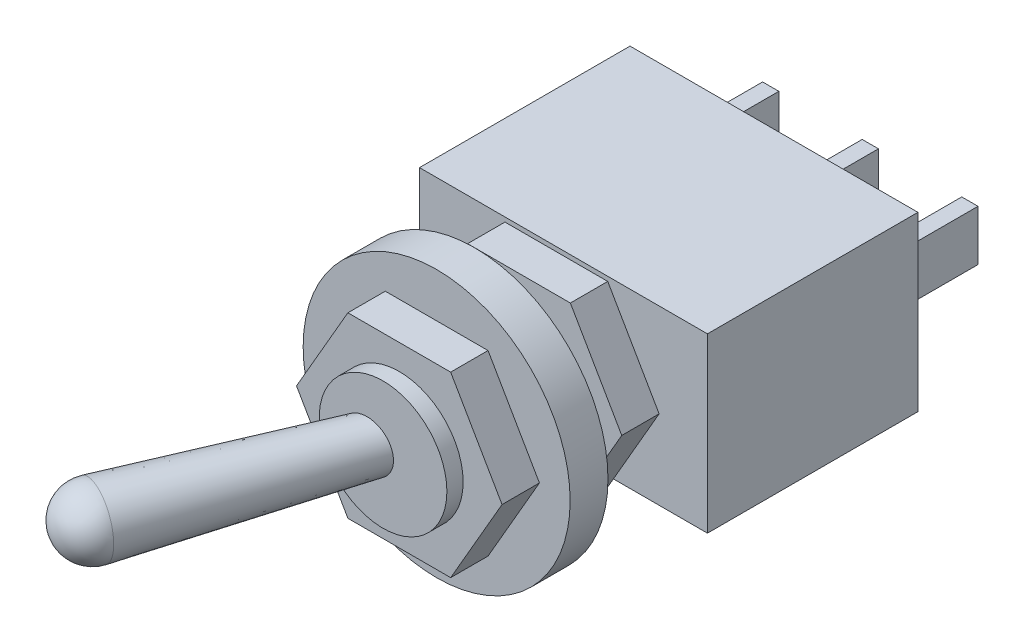
ISO-10303-21;
HEADER;
FILE_DESCRIPTION(('STEP AP214'),'2;1');
FILE_NAME('part.step','',(''),(''),'','','');
FILE_SCHEMA(('AUTOMOTIVE_DESIGN { 1 0 10303 214 1 1 1 1 }'));
ENDSEC;
DATA;
#1=APPLICATION_CONTEXT('core data for automotive mechanical design processes');
#2=APPLICATION_PROTOCOL_DEFINITION('international standard','automotive_design',2000,#1);
#3=PRODUCT_CONTEXT('',#1,'mechanical');
#4=PRODUCT('Part','Part','',(#3));
#5=PRODUCT_RELATED_PRODUCT_CATEGORY('part','',(#4));
#6=PRODUCT_DEFINITION_FORMATION('','',#4);
#7=PRODUCT_DEFINITION_CONTEXT('part definition',#1,'design');
#8=PRODUCT_DEFINITION('design','',#6,#7);
#9=PRODUCT_DEFINITION_SHAPE('','',#8);
#10=(LENGTH_UNIT() NAMED_UNIT(*) SI_UNIT(.MILLI.,.METRE.));
#11=(NAMED_UNIT(*) PLANE_ANGLE_UNIT() SI_UNIT($,.RADIAN.));
#12=(NAMED_UNIT(*) SI_UNIT($,.STERADIAN.) SOLID_ANGLE_UNIT());
#13=UNCERTAINTY_MEASURE_WITH_UNIT(LENGTH_MEASURE(1.E-05),#10,'distance_accuracy_value','');
#14=(GEOMETRIC_REPRESENTATION_CONTEXT(3) GLOBAL_UNCERTAINTY_ASSIGNED_CONTEXT((#13)) GLOBAL_UNIT_ASSIGNED_CONTEXT((#10,
#11,#12)) REPRESENTATION_CONTEXT('',''));
#15=CARTESIAN_POINT('',(0.,0.,0.));
#16=DIRECTION('',(0.,0.,1.));
#17=DIRECTION('',(1.,0.,0.));
#18=AXIS2_PLACEMENT_3D('',#15,#16,#17);
#19=CARTESIAN_POINT('',(0.,0.,15.16));
#20=DIRECTION('',(0.,0.,1.));
#21=DIRECTION('',(1.,0.,0.));
#22=AXIS2_PLACEMENT_3D('',#19,#20,#21);
#23=PLANE('',#22);
#24=CARTESIAN_POINT('',(0.,0.,15.16));
#25=DIRECTION('',(0.,0.,1.));
#26=DIRECTION('',(1.,0.,0.));
#27=AXIS2_PLACEMENT_3D('',#24,#25,#26);
#28=CIRCLE('',#27,6.);
#29=CARTESIAN_POINT('',(6.,0.,15.16));
#30=VERTEX_POINT('',#29);
#31=EDGE_CURVE('E266',#30,#30,#28,.T.);
#32=ORIENTED_EDGE('',*,*,#31,.T.);
#33=EDGE_LOOP('',(#32));
#34=FACE_BOUND('',#33,.T.);
#35=DIRECTION('',(1.,0.,0.));
#36=VECTOR('',#35,1.);
#37=CARTESIAN_POINT('',(-2.30940107675851,-4.,15.16));
#38=LINE('',#37,#36);
#39=CARTESIAN_POINT('',(-2.30940107675851,-4.,15.16));
#40=VERTEX_POINT('',#39);
#41=CARTESIAN_POINT('',(2.3094010767585,-4.,15.16));
#42=VERTEX_POINT('',#41);
#43=EDGE_CURVE('E950',#40,#42,#38,.T.);
#44=ORIENTED_EDGE('',*,*,#43,.F.);
#45=DIRECTION('',(0.5,-0.866025403784439,0.));
#46=VECTOR('',#45,1.);
#47=CARTESIAN_POINT('',(-4.61880215351701,0.,15.16));
#48=LINE('',#47,#46);
#49=CARTESIAN_POINT('',(-4.61880215351701,0.,15.16));
#50=VERTEX_POINT('',#49);
#51=EDGE_CURVE('E257',#50,#40,#48,.T.);
#52=ORIENTED_EDGE('',*,*,#51,.F.);
#53=DIRECTION('',(-0.5,-0.866025403784439,0.));
#54=VECTOR('',#53,1.);
#55=CARTESIAN_POINT('',(-2.3094010767585,4.,15.16));
#56=LINE('',#55,#54);
#57=CARTESIAN_POINT('',(-2.3094010767585,4.,15.16));
#58=VERTEX_POINT('',#57);
#59=EDGE_CURVE('E253',#58,#50,#56,.T.);
#60=ORIENTED_EDGE('',*,*,#59,.F.);
#61=DIRECTION('',(-1.,0.,0.));
#62=VECTOR('',#61,1.);
#63=CARTESIAN_POINT('',(2.3094010767585,4.,15.16));
#64=LINE('',#63,#62);
#65=CARTESIAN_POINT('',(2.3094010767585,4.,15.16));
#66=VERTEX_POINT('',#65);
#67=EDGE_CURVE('E958',#66,#58,#64,.T.);
#68=ORIENTED_EDGE('',*,*,#67,.F.);
#69=DIRECTION('',(-0.499999999999999,0.866025403784439,0.));
#70=VECTOR('',#69,1.);
#71=CARTESIAN_POINT('',(4.618802153517,0.,15.16));
#72=LINE('',#71,#70);
#73=CARTESIAN_POINT('',(4.618802153517,0.,15.16));
#74=VERTEX_POINT('',#73);
#75=EDGE_CURVE('E949',#74,#66,#72,.T.);
#76=ORIENTED_EDGE('',*,*,#75,.F.);
#77=DIRECTION('',(0.5,0.866025403784439,0.));
#78=VECTOR('',#77,1.);
#79=CARTESIAN_POINT('',(2.3094010767585,-4.,15.16));
#80=LINE('',#79,#78);
#81=EDGE_CURVE('E945',#42,#74,#80,.T.);
#82=ORIENTED_EDGE('',*,*,#81,.F.);
#83=EDGE_LOOP('',(#44,#52,#60,#68,#76,#82));
#84=FACE_BOUND('',#83,.T.);
#85=ADVANCED_FACE('F47',(#34,#84),#23,.T.);
#86=CARTESIAN_POINT('',(0.,0.,17.57));
#87=DIRECTION('',(0.,0.,-1.));
#88=DIRECTION('',(-1.,0.,0.));
#89=AXIS2_PLACEMENT_3D('',#86,#87,#88);
#90=CYLINDRICAL_SURFACE('',#89,2.87);
#91=CARTESIAN_POINT('',(0.,0.,11.46));
#92=DIRECTION('',(0.,0.,1.));
#93=DIRECTION('',(1.,0.,0.));
#94=AXIS2_PLACEMENT_3D('',#91,#92,#93);
#95=CIRCLE('',#94,2.87);
#96=CARTESIAN_POINT('',(2.87,0.,11.46));
#97=VERTEX_POINT('',#96);
#98=EDGE_CURVE('E310',#97,#97,#95,.T.);
#99=ORIENTED_EDGE('',*,*,#98,.T.);
#100=EDGE_LOOP('',(#99));
#101=FACE_BOUND('',#100,.T.);
#102=CARTESIAN_POINT('',(0.,0.,13.46));
#103=DIRECTION('',(0.,0.,1.));
#104=DIRECTION('',(1.,0.,0.));
#105=AXIS2_PLACEMENT_3D('',#102,#103,#104);
#106=CIRCLE('',#105,2.87);
#107=CARTESIAN_POINT('',(2.87,0.,13.46));
#108=VERTEX_POINT('',#107);
#109=EDGE_CURVE('E13',#108,#108,#106,.T.);
#110=ORIENTED_EDGE('',*,*,#109,.F.);
#111=EDGE_LOOP('',(#110));
#112=FACE_BOUND('',#111,.T.);
#113=ADVANCED_FACE('F458',(#101,#112),#90,.T.);
#114=CARTESIAN_POINT('',(0.,0.,9.46));
#115=DIRECTION('',(0.,0.,1.));
#116=DIRECTION('',(1.,0.,0.));
#117=AXIS2_PLACEMENT_3D('',#114,#115,#116);
#118=CIRCLE('',#117,2.87);
#119=CARTESIAN_POINT('',(2.87,0.,9.46));
#120=VERTEX_POINT('',#119);
#121=EDGE_CURVE('E412',#120,#120,#118,.T.);
#122=ORIENTED_EDGE('',*,*,#121,.T.);
#123=EDGE_LOOP('',(#122));
#124=FACE_BOUND('',#123,.T.);
#125=CARTESIAN_POINT('',(0.,0.,9.78));
#126=DIRECTION('',(0.,0.,1.));
#127=DIRECTION('',(1.,0.,0.));
#128=AXIS2_PLACEMENT_3D('',#125,#126,#127);
#129=CIRCLE('',#128,2.87);
#130=CARTESIAN_POINT('',(2.87,0.,9.78));
#131=VERTEX_POINT('',#130);
#132=EDGE_CURVE('E56',#131,#131,#129,.T.);
#133=ORIENTED_EDGE('',*,*,#132,.F.);
#134=EDGE_LOOP('',(#133));
#135=FACE_BOUND('',#134,.T.);
#136=ADVANCED_FACE('F455',(#124,#135),#90,.T.);
#137=CARTESIAN_POINT('',(0.,0.,0.));
#138=DIRECTION('',(0.,0.,-1.));
#139=DIRECTION('',(-1.,0.,0.));
#140=AXIS2_PLACEMENT_3D('',#137,#138,#139);
#141=PLANE('',#140);
#142=DIRECTION('',(0.,1.,0.));
#143=VECTOR('',#142,1.);
#144=CARTESIAN_POINT('',(6.47,-3.88,0.));
#145=LINE('',#144,#143);
#146=CARTESIAN_POINT('',(6.47,-3.88,0.));
#147=VERTEX_POINT('',#146);
#148=CARTESIAN_POINT('',(6.47,3.88,0.));
#149=VERTEX_POINT('',#148);
#150=EDGE_CURVE('E411',#147,#149,#145,.T.);
#151=ORIENTED_EDGE('',*,*,#150,.F.);
#152=DIRECTION('',(1.,0.,0.));
#153=VECTOR('',#152,1.);
#154=CARTESIAN_POINT('',(-6.47,-3.88,0.));
#155=LINE('',#154,#153);
#156=CARTESIAN_POINT('',(-6.47,-3.88,0.));
#157=VERTEX_POINT('',#156);
#158=EDGE_CURVE('E421',#157,#147,#155,.T.);
#159=ORIENTED_EDGE('',*,*,#158,.F.);
#160=DIRECTION('',(0.,-1.,0.));
#161=VECTOR('',#160,1.);
#162=CARTESIAN_POINT('',(-6.47,-3.88,0.));
#163=LINE('',#162,#161);
#164=CARTESIAN_POINT('',(-6.47,3.88,0.));
#165=VERTEX_POINT('',#164);
#166=EDGE_CURVE('E432',#165,#157,#163,.T.);
#167=ORIENTED_EDGE('',*,*,#166,.F.);
#168=DIRECTION('',(-1.,0.,0.));
#169=VECTOR('',#168,1.);
#170=CARTESIAN_POINT('',(-6.47,3.88,0.));
#171=LINE('',#170,#169);
#172=EDGE_CURVE('E430',#149,#165,#171,.T.);
#173=ORIENTED_EDGE('',*,*,#172,.F.);
#174=EDGE_LOOP('',(#151,#159,#167,#173));
#175=FACE_BOUND('',#174,.T.);
#176=DIRECTION('',(-1.,0.,0.));
#177=VECTOR('',#176,1.);
#178=CARTESIAN_POINT('',(-0.365,-1.135,0.));
#179=LINE('',#178,#177);
#180=CARTESIAN_POINT('',(0.365,-1.135,0.));
#181=VERTEX_POINT('',#180);
#182=CARTESIAN_POINT('',(-0.365,-1.135,0.));
#183=VERTEX_POINT('',#182);
#184=EDGE_CURVE('E390',#181,#183,#179,.T.);
#185=ORIENTED_EDGE('',*,*,#184,.F.);
#186=DIRECTION('',(0.,-1.,0.));
#187=VECTOR('',#186,1.);
#188=CARTESIAN_POINT('',(0.365,-1.135,0.));
#189=LINE('',#188,#187);
#190=CARTESIAN_POINT('',(0.365,1.135,0.));
#191=VERTEX_POINT('',#190);
#192=EDGE_CURVE('E376',#191,#181,#189,.T.);
#193=ORIENTED_EDGE('',*,*,#192,.F.);
#194=DIRECTION('',(1.,0.,0.));
#195=VECTOR('',#194,1.);
#196=CARTESIAN_POINT('',(-0.365,1.135,0.));
#197=LINE('',#196,#195);
#198=CARTESIAN_POINT('',(-0.365,1.135,0.));
#199=VERTEX_POINT('',#198);
#200=EDGE_CURVE('E381',#199,#191,#197,.T.);
#201=ORIENTED_EDGE('',*,*,#200,.F.);
#202=DIRECTION('',(0.,1.,0.));
#203=VECTOR('',#202,1.);
#204=CARTESIAN_POINT('',(-0.365,-1.135,0.));
#205=LINE('',#204,#203);
#206=EDGE_CURVE('E392',#183,#199,#205,.T.);
#207=ORIENTED_EDGE('',*,*,#206,.F.);
#208=EDGE_LOOP('',(#185,#193,#201,#207));
#209=FACE_BOUND('',#208,.T.);
#210=DIRECTION('',(-1.,0.,0.));
#211=VECTOR('',#210,1.);
#212=CARTESIAN_POINT('',(4.11,-1.135,0.));
#213=LINE('',#212,#211);
#214=CARTESIAN_POINT('',(4.84,-1.135,0.));
#215=VERTEX_POINT('',#214);
#216=CARTESIAN_POINT('',(4.11,-1.135,0.));
#217=VERTEX_POINT('',#216);
#218=EDGE_CURVE('E361',#215,#217,#213,.T.);
#219=ORIENTED_EDGE('',*,*,#218,.F.);
#220=DIRECTION('',(0.,-1.,0.));
#221=VECTOR('',#220,1.);
#222=CARTESIAN_POINT('',(4.84,-1.135,0.));
#223=LINE('',#222,#221);
#224=CARTESIAN_POINT('',(4.84,1.135,0.));
#225=VERTEX_POINT('',#224);
#226=EDGE_CURVE('E347',#225,#215,#223,.T.);
#227=ORIENTED_EDGE('',*,*,#226,.F.);
#228=DIRECTION('',(1.,0.,0.));
#229=VECTOR('',#228,1.);
#230=CARTESIAN_POINT('',(4.11,1.135,0.));
#231=LINE('',#230,#229);
#232=CARTESIAN_POINT('',(4.11,1.135,0.));
#233=VERTEX_POINT('',#232);
#234=EDGE_CURVE('E352',#233,#225,#231,.T.);
#235=ORIENTED_EDGE('',*,*,#234,.F.);
#236=DIRECTION('',(0.,1.,0.));
#237=VECTOR('',#236,1.);
#238=CARTESIAN_POINT('',(4.11,-1.135,0.));
#239=LINE('',#238,#237);
#240=EDGE_CURVE('E363',#217,#233,#239,.T.);
#241=ORIENTED_EDGE('',*,*,#240,.F.);
#242=EDGE_LOOP('',(#219,#227,#235,#241));
#243=FACE_BOUND('',#242,.T.);
#244=DIRECTION('',(-1.,0.,0.));
#245=VECTOR('',#244,1.);
#246=CARTESIAN_POINT('',(-4.84,-1.135,0.));
#247=LINE('',#246,#245);
#248=CARTESIAN_POINT('',(-4.11,-1.135,0.));
#249=VERTEX_POINT('',#248);
#250=CARTESIAN_POINT('',(-4.84,-1.135,0.));
#251=VERTEX_POINT('',#250);
#252=EDGE_CURVE('E334',#249,#251,#247,.T.);
#253=ORIENTED_EDGE('',*,*,#252,.F.);
#254=DIRECTION('',(0.,-1.,0.));
#255=VECTOR('',#254,1.);
#256=CARTESIAN_POINT('',(-4.11,-1.135,0.));
#257=LINE('',#256,#255);
#258=CARTESIAN_POINT('',(-4.11,1.135,0.));
#259=VERTEX_POINT('',#258);
#260=EDGE_CURVE('E331',#259,#249,#257,.T.);
#261=ORIENTED_EDGE('',*,*,#260,.F.);
#262=DIRECTION('',(1.,0.,0.));
#263=VECTOR('',#262,1.);
#264=CARTESIAN_POINT('',(-4.84,1.135,0.));
#265=LINE('',#264,#263);
#266=CARTESIAN_POINT('',(-4.84,1.135,0.));
#267=VERTEX_POINT('',#266);
#268=EDGE_CURVE('E324',#267,#259,#265,.T.);
#269=ORIENTED_EDGE('',*,*,#268,.F.);
#270=DIRECTION('',(0.,1.,0.));
#271=VECTOR('',#270,1.);
#272=CARTESIAN_POINT('',(-4.84,-1.135,0.));
#273=LINE('',#272,#271);
#274=EDGE_CURVE('E336',#251,#267,#273,.T.);
#275=ORIENTED_EDGE('',*,*,#274,.F.);
#276=EDGE_LOOP('',(#253,#261,#269,#275));
#277=FACE_BOUND('',#276,.T.);
#278=ADVANCED_FACE('F457',(#175,#209,#243,#277),#141,.T.);
#279=CARTESIAN_POINT('',(6.47,-3.88,9.46));
#280=DIRECTION('',(-1.,0.,0.));
#281=DIRECTION('',(0.,0.,1.));
#282=AXIS2_PLACEMENT_3D('',#279,#280,#281);
#283=PLANE('',#282);
#284=ORIENTED_EDGE('',*,*,#150,.T.);
#285=DIRECTION('',(0.,0.,-1.));
#286=VECTOR('',#285,1.);
#287=CARTESIAN_POINT('',(6.47,3.88,9.46));
#288=LINE('',#287,#286);
#289=CARTESIAN_POINT('',(6.47,3.88,9.46));
#290=VERTEX_POINT('',#289);
#291=EDGE_CURVE('E416',#290,#149,#288,.T.);
#292=ORIENTED_EDGE('',*,*,#291,.F.);
#293=DIRECTION('',(0.,1.,0.));
#294=VECTOR('',#293,1.);
#295=CARTESIAN_POINT('',(6.47,-3.88,9.46));
#296=LINE('',#295,#294);
#297=CARTESIAN_POINT('',(6.47,-3.88,9.46));
#298=VERTEX_POINT('',#297);
#299=EDGE_CURVE('E417',#298,#290,#296,.T.);
#300=ORIENTED_EDGE('',*,*,#299,.F.);
#301=DIRECTION('',(0.,0.,-1.));
#302=VECTOR('',#301,1.);
#303=CARTESIAN_POINT('',(6.47,-3.88,9.46));
#304=LINE('',#303,#302);
#305=EDGE_CURVE('E427',#298,#147,#304,.T.);
#306=ORIENTED_EDGE('',*,*,#305,.T.);
#307=EDGE_LOOP('',(#284,#292,#300,#306));
#308=FACE_BOUND('',#307,.T.);
#309=ADVANCED_FACE('F49',(#308),#283,.F.);
#310=CARTESIAN_POINT('',(-6.47,3.88,9.46));
#311=DIRECTION('',(0.,-1.,0.));
#312=DIRECTION('',(0.,0.,-1.));
#313=AXIS2_PLACEMENT_3D('',#310,#311,#312);
#314=PLANE('',#313);
#315=ORIENTED_EDGE('',*,*,#172,.T.);
#316=DIRECTION('',(0.,0.,-1.));
#317=VECTOR('',#316,1.);
#318=CARTESIAN_POINT('',(-6.47,3.88,9.46));
#319=LINE('',#318,#317);
#320=CARTESIAN_POINT('',(-6.47,3.88,9.46));
#321=VERTEX_POINT('',#320);
#322=EDGE_CURVE('E440',#321,#165,#319,.T.);
#323=ORIENTED_EDGE('',*,*,#322,.F.);
#324=DIRECTION('',(-1.,0.,0.));
#325=VECTOR('',#324,1.);
#326=CARTESIAN_POINT('',(-6.47,3.88,9.46));
#327=LINE('',#326,#325);
#328=EDGE_CURVE('E420',#290,#321,#327,.T.);
#329=ORIENTED_EDGE('',*,*,#328,.F.);
#330=ORIENTED_EDGE('',*,*,#291,.T.);
#331=EDGE_LOOP('',(#315,#323,#329,#330));
#332=FACE_BOUND('',#331,.T.);
#333=ADVANCED_FACE('F859',(#332),#314,.F.);
#334=CARTESIAN_POINT('',(-6.47,-3.88,9.46));
#335=DIRECTION('',(1.,0.,0.));
#336=DIRECTION('',(0.,0.,-1.));
#337=AXIS2_PLACEMENT_3D('',#334,#335,#336);
#338=PLANE('',#337);
#339=ORIENTED_EDGE('',*,*,#166,.T.);
#340=DIRECTION('',(0.,0.,-1.));
#341=VECTOR('',#340,1.);
#342=CARTESIAN_POINT('',(-6.47,-3.88,9.46));
#343=LINE('',#342,#341);
#344=CARTESIAN_POINT('',(-6.47,-3.88,9.46));
#345=VERTEX_POINT('',#344);
#346=EDGE_CURVE('E437',#345,#157,#343,.T.);
#347=ORIENTED_EDGE('',*,*,#346,.F.);
#348=DIRECTION('',(0.,-1.,0.));
#349=VECTOR('',#348,1.);
#350=CARTESIAN_POINT('',(-6.47,-3.88,9.46));
#351=LINE('',#350,#349);
#352=EDGE_CURVE('E423',#321,#345,#351,.T.);
#353=ORIENTED_EDGE('',*,*,#352,.F.);
#354=ORIENTED_EDGE('',*,*,#322,.T.);
#355=EDGE_LOOP('',(#339,#347,#353,#354));
#356=FACE_BOUND('',#355,.T.);
#357=ADVANCED_FACE('F866',(#356),#338,.F.);
#358=CARTESIAN_POINT('',(-6.47,-3.88,9.46));
#359=DIRECTION('',(0.,1.,0.));
#360=DIRECTION('',(0.,0.,1.));
#361=AXIS2_PLACEMENT_3D('',#358,#359,#360);
#362=PLANE('',#361);
#363=ORIENTED_EDGE('',*,*,#158,.T.);
#364=ORIENTED_EDGE('',*,*,#305,.F.);
#365=DIRECTION('',(1.,0.,0.));
#366=VECTOR('',#365,1.);
#367=CARTESIAN_POINT('',(-6.47,-3.88,9.46));
#368=LINE('',#367,#366);
#369=EDGE_CURVE('E425',#345,#298,#368,.T.);
#370=ORIENTED_EDGE('',*,*,#369,.F.);
#371=ORIENTED_EDGE('',*,*,#346,.T.);
#372=EDGE_LOOP('',(#363,#364,#370,#371));
#373=FACE_BOUND('',#372,.T.);
#374=ADVANCED_FACE('F873',(#373),#362,.F.);
#375=CARTESIAN_POINT('',(0.,0.,9.46));
#376=DIRECTION('',(0.,0.,-1.));
#377=DIRECTION('',(-1.,0.,0.));
#378=AXIS2_PLACEMENT_3D('',#375,#376,#377);
#379=PLANE('',#378);
#380=ORIENTED_EDGE('',*,*,#121,.F.);
#381=EDGE_LOOP('',(#380));
#382=FACE_BOUND('',#381,.T.);
#383=ORIENTED_EDGE('',*,*,#299,.T.);
#384=ORIENTED_EDGE('',*,*,#328,.T.);
#385=ORIENTED_EDGE('',*,*,#352,.T.);
#386=ORIENTED_EDGE('',*,*,#369,.T.);
#387=EDGE_LOOP('',(#383,#384,#385,#386));
#388=FACE_BOUND('',#387,.T.);
#389=ADVANCED_FACE('F579',(#382,#388),#379,.F.);
#390=CARTESIAN_POINT('',(0.365,-1.135,-4.33));
#391=DIRECTION('',(-1.,0.,0.));
#392=DIRECTION('',(0.,-1.,0.));
#393=AXIS2_PLACEMENT_3D('',#390,#391,#392);
#394=PLANE('',#393);
#395=ORIENTED_EDGE('',*,*,#192,.T.);
#396=DIRECTION('',(0.,0.,1.));
#397=VECTOR('',#396,1.);
#398=CARTESIAN_POINT('',(0.365,-1.135,-4.33));
#399=LINE('',#398,#397);
#400=CARTESIAN_POINT('',(0.365,-1.135,-4.33));
#401=VERTEX_POINT('',#400);
#402=EDGE_CURVE('E403',#401,#181,#399,.T.);
#403=ORIENTED_EDGE('',*,*,#402,.F.);
#404=DIRECTION('',(0.,-1.,0.));
#405=VECTOR('',#404,1.);
#406=CARTESIAN_POINT('',(0.365,-1.135,-4.33));
#407=LINE('',#406,#405);
#408=CARTESIAN_POINT('',(0.365,1.135,-4.33));
#409=VERTEX_POINT('',#408);
#410=EDGE_CURVE('E377',#409,#401,#407,.T.);
#411=ORIENTED_EDGE('',*,*,#410,.F.);
#412=DIRECTION('',(0.,0.,1.));
#413=VECTOR('',#412,1.);
#414=CARTESIAN_POINT('',(0.365,1.135,-4.33));
#415=LINE('',#414,#413);
#416=EDGE_CURVE('E387',#409,#191,#415,.T.);
#417=ORIENTED_EDGE('',*,*,#416,.T.);
#418=EDGE_LOOP('',(#395,#403,#411,#417));
#419=FACE_BOUND('',#418,.T.);
#420=ADVANCED_FACE('F575',(#419),#394,.F.);
#421=CARTESIAN_POINT('',(-0.365,-1.135,-4.33));
#422=DIRECTION('',(0.,1.,0.));
#423=DIRECTION('',(-1.,0.,0.));
#424=AXIS2_PLACEMENT_3D('',#421,#422,#423);
#425=PLANE('',#424);
#426=ORIENTED_EDGE('',*,*,#184,.T.);
#427=DIRECTION('',(0.,0.,1.));
#428=VECTOR('',#427,1.);
#429=CARTESIAN_POINT('',(-0.365,-1.135,-4.33));
#430=LINE('',#429,#428);
#431=CARTESIAN_POINT('',(-0.365,-1.135,-4.33));
#432=VERTEX_POINT('',#431);
#433=EDGE_CURVE('E400',#432,#183,#430,.T.);
#434=ORIENTED_EDGE('',*,*,#433,.F.);
#435=DIRECTION('',(-1.,0.,0.));
#436=VECTOR('',#435,1.);
#437=CARTESIAN_POINT('',(-0.365,-1.135,-4.33));
#438=LINE('',#437,#436);
#439=EDGE_CURVE('E380',#401,#432,#438,.T.);
#440=ORIENTED_EDGE('',*,*,#439,.F.);
#441=ORIENTED_EDGE('',*,*,#402,.T.);
#442=EDGE_LOOP('',(#426,#434,#440,#441));
#443=FACE_BOUND('',#442,.T.);
#444=ADVANCED_FACE('F571',(#443),#425,.F.);
#445=CARTESIAN_POINT('',(-0.365,-1.135,-4.33));
#446=DIRECTION('',(1.,0.,0.));
#447=DIRECTION('',(0.,0.,-1.));
#448=AXIS2_PLACEMENT_3D('',#445,#446,#447);
#449=PLANE('',#448);
#450=ORIENTED_EDGE('',*,*,#206,.T.);
#451=DIRECTION('',(0.,0.,1.));
#452=VECTOR('',#451,1.);
#453=CARTESIAN_POINT('',(-0.365,1.135,-4.33));
#454=LINE('',#453,#452);
#455=CARTESIAN_POINT('',(-0.365,1.135,-4.33));
#456=VERTEX_POINT('',#455);
#457=EDGE_CURVE('E398',#456,#199,#454,.T.);
#458=ORIENTED_EDGE('',*,*,#457,.F.);
#459=DIRECTION('',(0.,1.,0.));
#460=VECTOR('',#459,1.);
#461=CARTESIAN_POINT('',(-0.365,-1.135,-4.33));
#462=LINE('',#461,#460);
#463=EDGE_CURVE('E383',#432,#456,#462,.T.);
#464=ORIENTED_EDGE('',*,*,#463,.F.);
#465=ORIENTED_EDGE('',*,*,#433,.T.);
#466=EDGE_LOOP('',(#450,#458,#464,#465));
#467=FACE_BOUND('',#466,.T.);
#468=ADVANCED_FACE('F567',(#467),#449,.F.);
#469=CARTESIAN_POINT('',(-0.365,1.135,-4.33));
#470=DIRECTION('',(0.,-1.,0.));
#471=DIRECTION('',(0.,0.,-1.));
#472=AXIS2_PLACEMENT_3D('',#469,#470,#471);
#473=PLANE('',#472);
#474=ORIENTED_EDGE('',*,*,#200,.T.);
#475=ORIENTED_EDGE('',*,*,#416,.F.);
#476=DIRECTION('',(1.,0.,0.));
#477=VECTOR('',#476,1.);
#478=CARTESIAN_POINT('',(-0.365,1.135,-4.33));
#479=LINE('',#478,#477);
#480=EDGE_CURVE('E385',#456,#409,#479,.T.);
#481=ORIENTED_EDGE('',*,*,#480,.F.);
#482=ORIENTED_EDGE('',*,*,#457,.T.);
#483=EDGE_LOOP('',(#474,#475,#481,#482));
#484=FACE_BOUND('',#483,.T.);
#485=ADVANCED_FACE('F563',(#484),#473,.F.);
#486=CARTESIAN_POINT('',(0.,0.,-4.33));
#487=DIRECTION('',(0.,0.,-1.));
#488=DIRECTION('',(-1.,0.,0.));
#489=AXIS2_PLACEMENT_3D('',#486,#487,#488);
#490=PLANE('',#489);
#491=ORIENTED_EDGE('',*,*,#410,.T.);
#492=ORIENTED_EDGE('',*,*,#439,.T.);
#493=ORIENTED_EDGE('',*,*,#463,.T.);
#494=ORIENTED_EDGE('',*,*,#480,.T.);
#495=EDGE_LOOP('',(#491,#492,#493,#494));
#496=FACE_BOUND('',#495,.T.);
#497=ADVANCED_FACE('F559',(#496),#490,.T.);
#498=CARTESIAN_POINT('',(4.84,-1.135,-4.33));
#499=DIRECTION('',(-1.,0.,0.));
#500=DIRECTION('',(0.,0.,1.));
#501=AXIS2_PLACEMENT_3D('',#498,#499,#500);
#502=PLANE('',#501);
#503=ORIENTED_EDGE('',*,*,#226,.T.);
#504=DIRECTION('',(0.,0.,1.));
#505=VECTOR('',#504,1.);
#506=CARTESIAN_POINT('',(4.84,-1.135,-4.33));
#507=LINE('',#506,#505);
#508=CARTESIAN_POINT('',(4.84,-1.135,-4.33));
#509=VERTEX_POINT('',#508);
#510=EDGE_CURVE('E374',#509,#215,#507,.T.);
#511=ORIENTED_EDGE('',*,*,#510,.F.);
#512=DIRECTION('',(0.,-1.,0.));
#513=VECTOR('',#512,1.);
#514=CARTESIAN_POINT('',(4.84,-1.135,-4.33));
#515=LINE('',#514,#513);
#516=CARTESIAN_POINT('',(4.84,1.135,-4.33));
#517=VERTEX_POINT('',#516);
#518=EDGE_CURVE('E348',#517,#509,#515,.T.);
#519=ORIENTED_EDGE('',*,*,#518,.F.);
#520=DIRECTION('',(0.,0.,1.));
#521=VECTOR('',#520,1.);
#522=CARTESIAN_POINT('',(4.84,1.135,-4.33));
#523=LINE('',#522,#521);
#524=EDGE_CURVE('E358',#517,#225,#523,.T.);
#525=ORIENTED_EDGE('',*,*,#524,.T.);
#526=EDGE_LOOP('',(#503,#511,#519,#525));
#527=FACE_BOUND('',#526,.T.);
#528=ADVANCED_FACE('F555',(#527),#502,.F.);
#529=CARTESIAN_POINT('',(4.11,-1.135,-4.33));
#530=DIRECTION('',(0.,1.,0.));
#531=DIRECTION('',(-1.,0.,0.));
#532=AXIS2_PLACEMENT_3D('',#529,#530,#531);
#533=PLANE('',#532);
#534=ORIENTED_EDGE('',*,*,#218,.T.);
#535=DIRECTION('',(0.,0.,1.));
#536=VECTOR('',#535,1.);
#537=CARTESIAN_POINT('',(4.11,-1.135,-4.33));
#538=LINE('',#537,#536);
#539=CARTESIAN_POINT('',(4.11,-1.135,-4.33));
#540=VERTEX_POINT('',#539);
#541=EDGE_CURVE('E371',#540,#217,#538,.T.);
#542=ORIENTED_EDGE('',*,*,#541,.F.);
#543=DIRECTION('',(-1.,0.,0.));
#544=VECTOR('',#543,1.);
#545=CARTESIAN_POINT('',(4.11,-1.135,-4.33));
#546=LINE('',#545,#544);
#547=EDGE_CURVE('E351',#509,#540,#546,.T.);
#548=ORIENTED_EDGE('',*,*,#547,.F.);
#549=ORIENTED_EDGE('',*,*,#510,.T.);
#550=EDGE_LOOP('',(#534,#542,#548,#549));
#551=FACE_BOUND('',#550,.T.);
#552=ADVANCED_FACE('F551',(#551),#533,.F.);
#553=CARTESIAN_POINT('',(4.11,-1.135,-4.33));
#554=DIRECTION('',(1.,0.,0.));
#555=DIRECTION('',(0.,0.,-1.));
#556=AXIS2_PLACEMENT_3D('',#553,#554,#555);
#557=PLANE('',#556);
#558=ORIENTED_EDGE('',*,*,#240,.T.);
#559=DIRECTION('',(0.,0.,1.));
#560=VECTOR('',#559,1.);
#561=CARTESIAN_POINT('',(4.11,1.135,-4.33));
#562=LINE('',#561,#560);
#563=CARTESIAN_POINT('',(4.11,1.135,-4.33));
#564=VERTEX_POINT('',#563);
#565=EDGE_CURVE('E369',#564,#233,#562,.T.);
#566=ORIENTED_EDGE('',*,*,#565,.F.);
#567=DIRECTION('',(0.,1.,0.));
#568=VECTOR('',#567,1.);
#569=CARTESIAN_POINT('',(4.11,-1.135,-4.33));
#570=LINE('',#569,#568);
#571=EDGE_CURVE('E354',#540,#564,#570,.T.);
#572=ORIENTED_EDGE('',*,*,#571,.F.);
#573=ORIENTED_EDGE('',*,*,#541,.T.);
#574=EDGE_LOOP('',(#558,#566,#572,#573));
#575=FACE_BOUND('',#574,.T.);
#576=ADVANCED_FACE('F547',(#575),#557,.F.);
#577=CARTESIAN_POINT('',(4.11,1.135,-4.33));
#578=DIRECTION('',(0.,-1.,0.));
#579=DIRECTION('',(0.,0.,-1.));
#580=AXIS2_PLACEMENT_3D('',#577,#578,#579);
#581=PLANE('',#580);
#582=ORIENTED_EDGE('',*,*,#234,.T.);
#583=ORIENTED_EDGE('',*,*,#524,.F.);
#584=DIRECTION('',(1.,0.,0.));
#585=VECTOR('',#584,1.);
#586=CARTESIAN_POINT('',(4.11,1.135,-4.33));
#587=LINE('',#586,#585);
#588=EDGE_CURVE('E356',#564,#517,#587,.T.);
#589=ORIENTED_EDGE('',*,*,#588,.F.);
#590=ORIENTED_EDGE('',*,*,#565,.T.);
#591=EDGE_LOOP('',(#582,#583,#589,#590));
#592=FACE_BOUND('',#591,.T.);
#593=ADVANCED_FACE('F543',(#592),#581,.F.);
#594=CARTESIAN_POINT('',(0.,0.,-4.33));
#595=DIRECTION('',(0.,0.,-1.));
#596=DIRECTION('',(-1.,0.,0.));
#597=AXIS2_PLACEMENT_3D('',#594,#595,#596);
#598=PLANE('',#597);
#599=ORIENTED_EDGE('',*,*,#518,.T.);
#600=ORIENTED_EDGE('',*,*,#547,.T.);
#601=ORIENTED_EDGE('',*,*,#571,.T.);
#602=ORIENTED_EDGE('',*,*,#588,.T.);
#603=EDGE_LOOP('',(#599,#600,#601,#602));
#604=FACE_BOUND('',#603,.T.);
#605=ADVANCED_FACE('F539',(#604),#598,.T.);
#606=CARTESIAN_POINT('',(-4.11,-1.135,-4.33));
#607=DIRECTION('',(-1.,0.,0.));
#608=DIRECTION('',(0.,0.,1.));
#609=AXIS2_PLACEMENT_3D('',#606,#607,#608);
#610=PLANE('',#609);
#611=ORIENTED_EDGE('',*,*,#260,.T.);
#612=DIRECTION('',(0.,0.,1.));
#613=VECTOR('',#612,1.);
#614=CARTESIAN_POINT('',(-4.11,-1.135,-4.33));
#615=LINE('',#614,#613);
#616=CARTESIAN_POINT('',(-4.11,-1.135,-4.33));
#617=VERTEX_POINT('',#616);
#618=EDGE_CURVE('E345',#617,#249,#615,.T.);
#619=ORIENTED_EDGE('',*,*,#618,.F.);
#620=DIRECTION('',(0.,-1.,0.));
#621=VECTOR('',#620,1.);
#622=CARTESIAN_POINT('',(-4.11,-1.135,-4.33));
#623=LINE('',#622,#621);
#624=CARTESIAN_POINT('',(-4.11,1.135,-4.33));
#625=VERTEX_POINT('',#624);
#626=EDGE_CURVE('E320',#625,#617,#623,.T.);
#627=ORIENTED_EDGE('',*,*,#626,.F.);
#628=DIRECTION('',(0.,0.,1.));
#629=VECTOR('',#628,1.);
#630=CARTESIAN_POINT('',(-4.11,1.135,-4.33));
#631=LINE('',#630,#629);
#632=EDGE_CURVE('E330',#625,#259,#631,.T.);
#633=ORIENTED_EDGE('',*,*,#632,.T.);
#634=EDGE_LOOP('',(#611,#619,#627,#633));
#635=FACE_BOUND('',#634,.T.);
#636=ADVANCED_FACE('F535',(#635),#610,.F.);
#637=CARTESIAN_POINT('',(-4.84,-1.135,-4.33));
#638=DIRECTION('',(0.,1.,0.));
#639=DIRECTION('',(-1.,0.,0.));
#640=AXIS2_PLACEMENT_3D('',#637,#638,#639);
#641=PLANE('',#640);
#642=ORIENTED_EDGE('',*,*,#252,.T.);
#643=DIRECTION('',(0.,0.,1.));
#644=VECTOR('',#643,1.);
#645=CARTESIAN_POINT('',(-4.84,-1.135,-4.33));
#646=LINE('',#645,#644);
#647=CARTESIAN_POINT('',(-4.84,-1.135,-4.33));
#648=VERTEX_POINT('',#647);
#649=EDGE_CURVE('E342',#648,#251,#646,.T.);
#650=ORIENTED_EDGE('',*,*,#649,.F.);
#651=DIRECTION('',(-1.,0.,0.));
#652=VECTOR('',#651,1.);
#653=CARTESIAN_POINT('',(-4.84,-1.135,-4.33));
#654=LINE('',#653,#652);
#655=EDGE_CURVE('E323',#617,#648,#654,.T.);
#656=ORIENTED_EDGE('',*,*,#655,.F.);
#657=ORIENTED_EDGE('',*,*,#618,.T.);
#658=EDGE_LOOP('',(#642,#650,#656,#657));
#659=FACE_BOUND('',#658,.T.);
#660=ADVANCED_FACE('F531',(#659),#641,.F.);
#661=CARTESIAN_POINT('',(-4.84,-1.135,-4.33));
#662=DIRECTION('',(1.,0.,0.));
#663=DIRECTION('',(0.,0.,-1.));
#664=AXIS2_PLACEMENT_3D('',#661,#662,#663);
#665=PLANE('',#664);
#666=ORIENTED_EDGE('',*,*,#274,.T.);
#667=DIRECTION('',(0.,0.,1.));
#668=VECTOR('',#667,1.);
#669=CARTESIAN_POINT('',(-4.84,1.135,-4.33));
#670=LINE('',#669,#668);
#671=CARTESIAN_POINT('',(-4.84,1.135,-4.33));
#672=VERTEX_POINT('',#671);
#673=EDGE_CURVE('E71',#672,#267,#670,.T.);
#674=ORIENTED_EDGE('',*,*,#673,.F.);
#675=DIRECTION('',(0.,1.,0.));
#676=VECTOR('',#675,1.);
#677=CARTESIAN_POINT('',(-4.84,-1.135,-4.33));
#678=LINE('',#677,#676);
#679=EDGE_CURVE('E326',#648,#672,#678,.T.);
#680=ORIENTED_EDGE('',*,*,#679,.F.);
#681=ORIENTED_EDGE('',*,*,#649,.T.);
#682=EDGE_LOOP('',(#666,#674,#680,#681));
#683=FACE_BOUND('',#682,.T.);
#684=ADVANCED_FACE('F528',(#683),#665,.F.);
#685=CARTESIAN_POINT('',(-4.84,1.135,-4.33));
#686=DIRECTION('',(0.,-1.,0.));
#687=DIRECTION('',(0.,0.,-1.));
#688=AXIS2_PLACEMENT_3D('',#685,#686,#687);
#689=PLANE('',#688);
#690=ORIENTED_EDGE('',*,*,#268,.T.);
#691=ORIENTED_EDGE('',*,*,#632,.F.);
#692=DIRECTION('',(1.,0.,0.));
#693=VECTOR('',#692,1.);
#694=CARTESIAN_POINT('',(-4.84,1.135,-4.33));
#695=LINE('',#694,#693);
#696=EDGE_CURVE('E328',#672,#625,#695,.T.);
#697=ORIENTED_EDGE('',*,*,#696,.F.);
#698=ORIENTED_EDGE('',*,*,#673,.T.);
#699=EDGE_LOOP('',(#690,#691,#697,#698));
#700=FACE_BOUND('',#699,.T.);
#701=ADVANCED_FACE('F524',(#700),#689,.F.);
#702=CARTESIAN_POINT('',(0.,0.,-4.33));
#703=DIRECTION('',(0.,0.,-1.));
#704=DIRECTION('',(-1.,0.,0.));
#705=AXIS2_PLACEMENT_3D('',#702,#703,#704);
#706=PLANE('',#705);
#707=ORIENTED_EDGE('',*,*,#626,.T.);
#708=ORIENTED_EDGE('',*,*,#655,.T.);
#709=ORIENTED_EDGE('',*,*,#679,.T.);
#710=ORIENTED_EDGE('',*,*,#696,.T.);
#711=EDGE_LOOP('',(#707,#708,#709,#710));
#712=FACE_BOUND('',#711,.T.);
#713=ADVANCED_FACE('F520',(#712),#706,.T.);
#714=CARTESIAN_POINT('',(-4.61880215351701,0.,9.78));
#715=DIRECTION('',(-0.866025403784439,-0.5,0.));
#716=DIRECTION('',(0.5,-0.866025403784439,0.));
#717=AXIS2_PLACEMENT_3D('',#714,#715,#716);
#718=PLANE('',#717);
#719=DIRECTION('',(0.5,-0.866025403784439,0.));
#720=VECTOR('',#719,1.);
#721=CARTESIAN_POINT('',(-4.61880215351701,0.,11.46));
#722=LINE('',#721,#720);
#723=CARTESIAN_POINT('',(-4.61880215351701,0.,11.46));
#724=VERTEX_POINT('',#723);
#725=CARTESIAN_POINT('',(-2.3094010767585,-4.,11.46));
#726=VERTEX_POINT('',#725);
#727=EDGE_CURVE('E269',#724,#726,#722,.T.);
#728=ORIENTED_EDGE('',*,*,#727,.F.);
#729=DIRECTION('',(0.,0.,1.));
#730=VECTOR('',#729,1.);
#731=CARTESIAN_POINT('',(-4.61880215351701,0.,9.78));
#732=LINE('',#731,#730);
#733=CARTESIAN_POINT('',(-4.61880215351701,0.,9.78));
#734=VERTEX_POINT('',#733);
#735=EDGE_CURVE('E308',#734,#724,#732,.T.);
#736=ORIENTED_EDGE('',*,*,#735,.F.);
#737=DIRECTION('',(0.5,-0.866025403784439,0.));
#738=VECTOR('',#737,1.);
#739=CARTESIAN_POINT('',(-4.61880215351701,0.,9.78));
#740=LINE('',#739,#738);
#741=CARTESIAN_POINT('',(-2.3094010767585,-4.,9.78));
#742=VERTEX_POINT('',#741);
#743=EDGE_CURVE('E272',#734,#742,#740,.T.);
#744=ORIENTED_EDGE('',*,*,#743,.T.);
#745=DIRECTION('',(0.,0.,1.));
#746=VECTOR('',#745,1.);
#747=CARTESIAN_POINT('',(-2.3094010767585,-4.,9.78));
#748=LINE('',#747,#746);
#749=EDGE_CURVE('E291',#742,#726,#748,.T.);
#750=ORIENTED_EDGE('',*,*,#749,.T.);
#751=EDGE_LOOP('',(#728,#736,#744,#750));
#752=FACE_BOUND('',#751,.T.);
#753=ADVANCED_FACE('F502',(#752),#718,.T.);
#754=CARTESIAN_POINT('',(-2.3094010767585,4.,9.78));
#755=DIRECTION('',(-0.866025403784439,0.5,0.));
#756=DIRECTION('',(-0.5,-0.866025403784439,0.));
#757=AXIS2_PLACEMENT_3D('',#754,#755,#756);
#758=PLANE('',#757);
#759=DIRECTION('',(-0.5,-0.866025403784439,0.));
#760=VECTOR('',#759,1.);
#761=CARTESIAN_POINT('',(-2.3094010767585,4.,11.46));
#762=LINE('',#761,#760);
#763=CARTESIAN_POINT('',(-2.3094010767585,4.,11.46));
#764=VERTEX_POINT('',#763);
#765=EDGE_CURVE('E276',#764,#724,#762,.T.);
#766=ORIENTED_EDGE('',*,*,#765,.F.);
#767=DIRECTION('',(0.,0.,1.));
#768=VECTOR('',#767,1.);
#769=CARTESIAN_POINT('',(-2.3094010767585,4.,9.78));
#770=LINE('',#769,#768);
#771=CARTESIAN_POINT('',(-2.3094010767585,4.,9.78));
#772=VERTEX_POINT('',#771);
#773=EDGE_CURVE('E311',#772,#764,#770,.T.);
#774=ORIENTED_EDGE('',*,*,#773,.F.);
#775=DIRECTION('',(-0.5,-0.866025403784439,0.));
#776=VECTOR('',#775,1.);
#777=CARTESIAN_POINT('',(-2.3094010767585,4.,9.78));
#778=LINE('',#777,#776);
#779=EDGE_CURVE('E288',#772,#734,#778,.T.);
#780=ORIENTED_EDGE('',*,*,#779,.T.);
#781=ORIENTED_EDGE('',*,*,#735,.T.);
#782=EDGE_LOOP('',(#766,#774,#780,#781));
#783=FACE_BOUND('',#782,.T.);
#784=ADVANCED_FACE('F498',(#783),#758,.T.);
#785=CARTESIAN_POINT('',(2.3094010767585,4.,9.78));
#786=DIRECTION('',(0.,1.,0.));
#787=DIRECTION('',(0.,0.,1.));
#788=AXIS2_PLACEMENT_3D('',#785,#786,#787);
#789=PLANE('',#788);
#790=DIRECTION('',(-1.,0.,0.));
#791=VECTOR('',#790,1.);
#792=CARTESIAN_POINT('',(2.3094010767585,4.,11.46));
#793=LINE('',#792,#791);
#794=CARTESIAN_POINT('',(2.3094010767585,4.,11.46));
#795=VERTEX_POINT('',#794);
#796=EDGE_CURVE('E303',#795,#764,#793,.T.);
#797=ORIENTED_EDGE('',*,*,#796,.F.);
#798=DIRECTION('',(0.,0.,1.));
#799=VECTOR('',#798,1.);
#800=CARTESIAN_POINT('',(2.3094010767585,4.,9.78));
#801=LINE('',#800,#799);
#802=CARTESIAN_POINT('',(2.3094010767585,4.,9.78));
#803=VERTEX_POINT('',#802);
#804=EDGE_CURVE('E313',#803,#795,#801,.T.);
#805=ORIENTED_EDGE('',*,*,#804,.F.);
#806=DIRECTION('',(-1.,0.,0.));
#807=VECTOR('',#806,1.);
#808=CARTESIAN_POINT('',(2.3094010767585,4.,9.78));
#809=LINE('',#808,#807);
#810=EDGE_CURVE('E285',#803,#772,#809,.T.);
#811=ORIENTED_EDGE('',*,*,#810,.T.);
#812=ORIENTED_EDGE('',*,*,#773,.T.);
#813=EDGE_LOOP('',(#797,#805,#811,#812));
#814=FACE_BOUND('',#813,.T.);
#815=ADVANCED_FACE('F501',(#814),#789,.T.);
#816=CARTESIAN_POINT('',(4.61880215351701,0.,9.78));
#817=DIRECTION('',(0.866025403784439,0.5,0.));
#818=DIRECTION('',(-0.5,0.866025403784439,0.));
#819=AXIS2_PLACEMENT_3D('',#816,#817,#818);
#820=PLANE('',#819);
#821=DIRECTION('',(-0.5,0.866025403784439,0.));
#822=VECTOR('',#821,1.);
#823=CARTESIAN_POINT('',(4.61880215351701,0.,11.46));
#824=LINE('',#823,#822);
#825=CARTESIAN_POINT('',(4.61880215351701,0.,11.46));
#826=VERTEX_POINT('',#825);
#827=EDGE_CURVE('E300',#826,#795,#824,.T.);
#828=ORIENTED_EDGE('',*,*,#827,.F.);
#829=DIRECTION('',(0.,0.,1.));
#830=VECTOR('',#829,1.);
#831=CARTESIAN_POINT('',(4.61880215351701,0.,9.78));
#832=LINE('',#831,#830);
#833=CARTESIAN_POINT('',(4.61880215351701,0.,9.78));
#834=VERTEX_POINT('',#833);
#835=EDGE_CURVE('E315',#834,#826,#832,.T.);
#836=ORIENTED_EDGE('',*,*,#835,.F.);
#837=DIRECTION('',(-0.5,0.866025403784439,0.));
#838=VECTOR('',#837,1.);
#839=CARTESIAN_POINT('',(4.61880215351701,0.,9.78));
#840=LINE('',#839,#838);
#841=EDGE_CURVE('E282',#834,#803,#840,.T.);
#842=ORIENTED_EDGE('',*,*,#841,.T.);
#843=ORIENTED_EDGE('',*,*,#804,.T.);
#844=EDGE_LOOP('',(#828,#836,#842,#843));
#845=FACE_BOUND('',#844,.T.);
#846=ADVANCED_FACE('F506',(#845),#820,.T.);
#847=CARTESIAN_POINT('',(2.3094010767585,-4.,9.78));
#848=DIRECTION('',(0.866025403784439,-0.5,0.));
#849=DIRECTION('',(0.5,0.866025403784439,0.));
#850=AXIS2_PLACEMENT_3D('',#847,#848,#849);
#851=PLANE('',#850);
#852=DIRECTION('',(0.5,0.866025403784438,0.));
#853=VECTOR('',#852,1.);
#854=CARTESIAN_POINT('',(2.3094010767585,-4.,11.46));
#855=LINE('',#854,#853);
#856=CARTESIAN_POINT('',(2.3094010767585,-4.,11.46));
#857=VERTEX_POINT('',#856);
#858=EDGE_CURVE('E297',#857,#826,#855,.T.);
#859=ORIENTED_EDGE('',*,*,#858,.F.);
#860=DIRECTION('',(0.,0.,1.));
#861=VECTOR('',#860,1.);
#862=CARTESIAN_POINT('',(2.3094010767585,-4.,9.78));
#863=LINE('',#862,#861);
#864=CARTESIAN_POINT('',(2.3094010767585,-4.,9.78));
#865=VERTEX_POINT('',#864);
#866=EDGE_CURVE('E317',#865,#857,#863,.T.);
#867=ORIENTED_EDGE('',*,*,#866,.F.);
#868=DIRECTION('',(0.5,0.866025403784438,0.));
#869=VECTOR('',#868,1.);
#870=CARTESIAN_POINT('',(2.3094010767585,-4.,9.78));
#871=LINE('',#870,#869);
#872=EDGE_CURVE('E279',#865,#834,#871,.T.);
#873=ORIENTED_EDGE('',*,*,#872,.T.);
#874=ORIENTED_EDGE('',*,*,#835,.T.);
#875=EDGE_LOOP('',(#859,#867,#873,#874));
#876=FACE_BOUND('',#875,.T.);
#877=ADVANCED_FACE('F510',(#876),#851,.T.);
#878=CARTESIAN_POINT('',(-2.3094010767585,-4.,9.78));
#879=DIRECTION('',(0.,-1.,0.));
#880=DIRECTION('',(0.,0.,-1.));
#881=AXIS2_PLACEMENT_3D('',#878,#879,#880);
#882=PLANE('',#881);
#883=DIRECTION('',(1.,0.,0.));
#884=VECTOR('',#883,1.);
#885=CARTESIAN_POINT('',(-2.3094010767585,-4.,11.46));
#886=LINE('',#885,#884);
#887=EDGE_CURVE('E294',#726,#857,#886,.T.);
#888=ORIENTED_EDGE('',*,*,#887,.F.);
#889=ORIENTED_EDGE('',*,*,#749,.F.);
#890=DIRECTION('',(1.,0.,0.));
#891=VECTOR('',#890,1.);
#892=CARTESIAN_POINT('',(-2.3094010767585,-4.,9.78));
#893=LINE('',#892,#891);
#894=EDGE_CURVE('E275',#742,#865,#893,.T.);
#895=ORIENTED_EDGE('',*,*,#894,.T.);
#896=ORIENTED_EDGE('',*,*,#866,.T.);
#897=EDGE_LOOP('',(#888,#889,#895,#896));
#898=FACE_BOUND('',#897,.T.);
#899=ADVANCED_FACE('F494',(#898),#882,.T.);
#900=CARTESIAN_POINT('',(0.,0.,9.78));
#901=DIRECTION('',(0.,0.,1.));
#902=DIRECTION('',(1.,0.,0.));
#903=AXIS2_PLACEMENT_3D('',#900,#901,#902);
#904=PLANE('',#903);
#905=ORIENTED_EDGE('',*,*,#132,.T.);
#906=EDGE_LOOP('',(#905));
#907=FACE_BOUND('',#906,.T.);
#908=ORIENTED_EDGE('',*,*,#743,.F.);
#909=ORIENTED_EDGE('',*,*,#779,.F.);
#910=ORIENTED_EDGE('',*,*,#810,.F.);
#911=ORIENTED_EDGE('',*,*,#841,.F.);
#912=ORIENTED_EDGE('',*,*,#872,.F.);
#913=ORIENTED_EDGE('',*,*,#894,.F.);
#914=EDGE_LOOP('',(#908,#909,#910,#911,#912,#913));
#915=FACE_BOUND('',#914,.T.);
#916=ADVANCED_FACE('F452',(#907,#915),#904,.F.);
#917=CARTESIAN_POINT('',(0.,0.,11.46));
#918=DIRECTION('',(0.,0.,1.));
#919=DIRECTION('',(1.,0.,0.));
#920=AXIS2_PLACEMENT_3D('',#917,#918,#919);
#921=PLANE('',#920);
#922=ORIENTED_EDGE('',*,*,#98,.F.);
#923=EDGE_LOOP('',(#922));
#924=FACE_BOUND('',#923,.T.);
#925=ORIENTED_EDGE('',*,*,#727,.T.);
#926=ORIENTED_EDGE('',*,*,#887,.T.);
#927=ORIENTED_EDGE('',*,*,#858,.T.);
#928=ORIENTED_EDGE('',*,*,#827,.T.);
#929=ORIENTED_EDGE('',*,*,#796,.T.);
#930=ORIENTED_EDGE('',*,*,#765,.T.);
#931=EDGE_LOOP('',(#925,#926,#927,#928,#929,#930));
#932=FACE_BOUND('',#931,.T.);
#933=ADVANCED_FACE('F490',(#924,#932),#921,.T.);
#934=CARTESIAN_POINT('',(0.,0.,15.16));
#935=DIRECTION('',(0.,0.,-1.));
#936=DIRECTION('',(-1.,0.,0.));
#937=AXIS2_PLACEMENT_3D('',#934,#935,#936);
#938=CYLINDRICAL_SURFACE('',#937,6.);
#939=ORIENTED_EDGE('',*,*,#31,.F.);
#940=EDGE_LOOP('',(#939));
#941=FACE_BOUND('',#940,.T.);
#942=CARTESIAN_POINT('',(0.,0.,13.46));
#943=DIRECTION('',(0.,0.,1.));
#944=DIRECTION('',(1.,0.,0.));
#945=AXIS2_PLACEMENT_3D('',#942,#943,#944);
#946=CIRCLE('',#945,6.);
#947=CARTESIAN_POINT('',(6.,0.,13.46));
#948=VERTEX_POINT('',#947);
#949=EDGE_CURVE('E261',#948,#948,#946,.T.);
#950=ORIENTED_EDGE('',*,*,#949,.T.);
#951=EDGE_LOOP('',(#950));
#952=FACE_BOUND('',#951,.T.);
#953=ADVANCED_FACE('F486',(#941,#952),#938,.T.);
#954=CARTESIAN_POINT('',(0.,0.,13.46));
#955=DIRECTION('',(0.,0.,1.));
#956=DIRECTION('',(1.,0.,0.));
#957=AXIS2_PLACEMENT_3D('',#954,#955,#956);
#958=PLANE('',#957);
#959=ORIENTED_EDGE('',*,*,#109,.T.);
#960=EDGE_LOOP('',(#959));
#961=FACE_BOUND('',#960,.T.);
#962=ORIENTED_EDGE('',*,*,#949,.F.);
#963=EDGE_LOOP('',(#962));
#964=FACE_BOUND('',#963,.T.);
#965=ADVANCED_FACE('F483',(#961,#964),#958,.F.);
#966=CARTESIAN_POINT('',(-4.61880215351701,0.,16.84));
#967=DIRECTION('',(0.866025403784439,0.5,0.));
#968=DIRECTION('',(-0.5,0.866025403784439,0.));
#969=AXIS2_PLACEMENT_3D('',#966,#967,#968);
#970=PLANE('',#969);
#971=ORIENTED_EDGE('',*,*,#51,.T.);
#972=DIRECTION('',(0.,0.,-1.));
#973=VECTOR('',#972,1.);
#974=CARTESIAN_POINT('',(-2.30940107675851,-4.,16.84));
#975=LINE('',#974,#973);
#976=CARTESIAN_POINT('',(-2.30940107675851,-4.,16.84));
#977=VERTEX_POINT('',#976);
#978=EDGE_CURVE('E238',#977,#40,#975,.T.);
#979=ORIENTED_EDGE('',*,*,#978,.F.);
#980=DIRECTION('',(0.5,-0.866025403784439,0.));
#981=VECTOR('',#980,1.);
#982=CARTESIAN_POINT('',(-4.61880215351701,0.,16.84));
#983=LINE('',#982,#981);
#984=CARTESIAN_POINT('',(-4.61880215351701,0.,16.84));
#985=VERTEX_POINT('',#984);
#986=EDGE_CURVE('E245',#985,#977,#983,.T.);
#987=ORIENTED_EDGE('',*,*,#986,.F.);
#988=DIRECTION('',(0.,0.,-1.));
#989=VECTOR('',#988,1.);
#990=CARTESIAN_POINT('',(-4.61880215351701,0.,16.84));
#991=LINE('',#990,#989);
#992=EDGE_CURVE('E964',#985,#50,#991,.T.);
#993=ORIENTED_EDGE('',*,*,#992,.T.);
#994=EDGE_LOOP('',(#971,#979,#987,#993));
#995=FACE_BOUND('',#994,.T.);
#996=ADVANCED_FACE('F255',(#995),#970,.F.);
#997=CARTESIAN_POINT('',(-2.30940107675851,-4.,16.84));
#998=DIRECTION('',(0.,1.,0.));
#999=DIRECTION('',(0.,0.,1.));
#1000=AXIS2_PLACEMENT_3D('',#997,#998,#999);
#1001=PLANE('',#1000);
#1002=ORIENTED_EDGE('',*,*,#43,.T.);
#1003=DIRECTION('',(0.,0.,-1.));
#1004=VECTOR('',#1003,1.);
#1005=CARTESIAN_POINT('',(2.3094010767585,-4.,16.84));
#1006=LINE('',#1005,#1004);
#1007=CARTESIAN_POINT('',(2.3094010767585,-4.,16.84));
#1008=VERTEX_POINT('',#1007);
#1009=EDGE_CURVE('E241',#1008,#42,#1006,.T.);
#1010=ORIENTED_EDGE('',*,*,#1009,.F.);
#1011=DIRECTION('',(1.,0.,0.));
#1012=VECTOR('',#1011,1.);
#1013=CARTESIAN_POINT('',(-2.30940107675851,-4.,16.84));
#1014=LINE('',#1013,#1012);
#1015=EDGE_CURVE('E234',#977,#1008,#1014,.T.);
#1016=ORIENTED_EDGE('',*,*,#1015,.F.);
#1017=ORIENTED_EDGE('',*,*,#978,.T.);
#1018=EDGE_LOOP('',(#1002,#1010,#1016,#1017));
#1019=FACE_BOUND('',#1018,.T.);
#1020=ADVANCED_FACE('F236',(#1019),#1001,.F.);
#1021=CARTESIAN_POINT('',(2.3094010767585,-4.,16.84));
#1022=DIRECTION('',(-0.866025403784439,0.5,0.));
#1023=DIRECTION('',(-0.5,-0.866025403784439,0.));
#1024=AXIS2_PLACEMENT_3D('',#1021,#1022,#1023);
#1025=PLANE('',#1024);
#1026=ORIENTED_EDGE('',*,*,#81,.T.);
#1027=DIRECTION('',(0.,0.,-1.));
#1028=VECTOR('',#1027,1.);
#1029=CARTESIAN_POINT('',(4.618802153517,0.,16.84));
#1030=LINE('',#1029,#1028);
#1031=CARTESIAN_POINT('',(4.618802153517,0.,16.84));
#1032=VERTEX_POINT('',#1031);
#1033=EDGE_CURVE('E262',#1032,#74,#1030,.T.);
#1034=ORIENTED_EDGE('',*,*,#1033,.F.);
#1035=DIRECTION('',(0.5,0.866025403784439,0.));
#1036=VECTOR('',#1035,1.);
#1037=CARTESIAN_POINT('',(2.3094010767585,-4.,16.84));
#1038=LINE('',#1037,#1036);
#1039=EDGE_CURVE('E244',#1008,#1032,#1038,.T.);
#1040=ORIENTED_EDGE('',*,*,#1039,.F.);
#1041=ORIENTED_EDGE('',*,*,#1009,.T.);
#1042=EDGE_LOOP('',(#1026,#1034,#1040,#1041));
#1043=FACE_BOUND('',#1042,.T.);
#1044=ADVANCED_FACE('F644',(#1043),#1025,.F.);
#1045=CARTESIAN_POINT('',(4.618802153517,0.,16.84));
#1046=DIRECTION('',(-0.866025403784439,-0.499999999999999,0.));
#1047=DIRECTION('',(0.499999999999999,-0.866025403784439,0.));
#1048=AXIS2_PLACEMENT_3D('',#1045,#1046,#1047);
#1049=PLANE('',#1048);
#1050=ORIENTED_EDGE('',*,*,#75,.T.);
#1051=DIRECTION('',(0.,0.,-1.));
#1052=VECTOR('',#1051,1.);
#1053=CARTESIAN_POINT('',(2.3094010767585,4.,16.84));
#1054=LINE('',#1053,#1052);
#1055=CARTESIAN_POINT('',(2.3094010767585,4.,16.84));
#1056=VERTEX_POINT('',#1055);
#1057=EDGE_CURVE('E955',#1056,#66,#1054,.T.);
#1058=ORIENTED_EDGE('',*,*,#1057,.F.);
#1059=DIRECTION('',(-0.499999999999999,0.866025403784439,0.));
#1060=VECTOR('',#1059,1.);
#1061=CARTESIAN_POINT('',(4.618802153517,0.,16.84));
#1062=LINE('',#1061,#1060);
#1063=EDGE_CURVE('E954',#1032,#1056,#1062,.T.);
#1064=ORIENTED_EDGE('',*,*,#1063,.F.);
#1065=ORIENTED_EDGE('',*,*,#1033,.T.);
#1066=EDGE_LOOP('',(#1050,#1058,#1064,#1065));
#1067=FACE_BOUND('',#1066,.T.);
#1068=ADVANCED_FACE('F634',(#1067),#1049,.F.);
#1069=CARTESIAN_POINT('',(2.3094010767585,4.,16.84));
#1070=DIRECTION('',(0.,-1.,0.));
#1071=DIRECTION('',(0.,0.,-1.));
#1072=AXIS2_PLACEMENT_3D('',#1069,#1070,#1071);
#1073=PLANE('',#1072);
#1074=ORIENTED_EDGE('',*,*,#67,.T.);
#1075=DIRECTION('',(0.,0.,-1.));
#1076=VECTOR('',#1075,1.);
#1077=CARTESIAN_POINT('',(-2.3094010767585,4.,16.84));
#1078=LINE('',#1077,#1076);
#1079=CARTESIAN_POINT('',(-2.3094010767585,4.,16.84));
#1080=VERTEX_POINT('',#1079);
#1081=EDGE_CURVE('E63',#1080,#58,#1078,.T.);
#1082=ORIENTED_EDGE('',*,*,#1081,.F.);
#1083=DIRECTION('',(-1.,0.,0.));
#1084=VECTOR('',#1083,1.);
#1085=CARTESIAN_POINT('',(2.3094010767585,4.,16.84));
#1086=LINE('',#1085,#1084);
#1087=EDGE_CURVE('E968',#1056,#1080,#1086,.T.);
#1088=ORIENTED_EDGE('',*,*,#1087,.F.);
#1089=ORIENTED_EDGE('',*,*,#1057,.T.);
#1090=EDGE_LOOP('',(#1074,#1082,#1088,#1089));
#1091=FACE_BOUND('',#1090,.T.);
#1092=ADVANCED_FACE('F625',(#1091),#1073,.F.);
#1093=CARTESIAN_POINT('',(-2.3094010767585,4.,16.84));
#1094=DIRECTION('',(0.866025403784439,-0.5,0.));
#1095=DIRECTION('',(0.5,0.866025403784439,0.));
#1096=AXIS2_PLACEMENT_3D('',#1093,#1094,#1095);
#1097=PLANE('',#1096);
#1098=ORIENTED_EDGE('',*,*,#59,.T.);
#1099=ORIENTED_EDGE('',*,*,#992,.F.);
#1100=DIRECTION('',(-0.5,-0.866025403784439,0.));
#1101=VECTOR('',#1100,1.);
#1102=CARTESIAN_POINT('',(-2.3094010767585,4.,16.84));
#1103=LINE('',#1102,#1101);
#1104=EDGE_CURVE('E249',#1080,#985,#1103,.T.);
#1105=ORIENTED_EDGE('',*,*,#1104,.F.);
#1106=ORIENTED_EDGE('',*,*,#1081,.T.);
#1107=EDGE_LOOP('',(#1098,#1099,#1105,#1106));
#1108=FACE_BOUND('',#1107,.T.);
#1109=ADVANCED_FACE('F615',(#1108),#1097,.F.);
#1110=CARTESIAN_POINT('',(0.,0.,16.84));
#1111=DIRECTION('',(0.,0.,1.));
#1112=DIRECTION('',(1.,0.,0.));
#1113=AXIS2_PLACEMENT_3D('',#1110,#1111,#1112);
#1114=PLANE('',#1113);
#1115=CARTESIAN_POINT('',(0.,0.,16.84));
#1116=DIRECTION('',(0.,0.,1.));
#1117=DIRECTION('',(1.,0.,0.));
#1118=AXIS2_PLACEMENT_3D('',#1115,#1116,#1117);
#1119=CIRCLE('',#1118,2.87);
#1120=CARTESIAN_POINT('',(2.87,0.,16.84));
#1121=VERTEX_POINT('',#1120);
#1122=EDGE_CURVE('E51',#1121,#1121,#1119,.T.);
#1123=ORIENTED_EDGE('',*,*,#1122,.F.);
#1124=EDGE_LOOP('',(#1123));
#1125=FACE_BOUND('',#1124,.T.);
#1126=ORIENTED_EDGE('',*,*,#986,.T.);
#1127=ORIENTED_EDGE('',*,*,#1015,.T.);
#1128=ORIENTED_EDGE('',*,*,#1039,.T.);
#1129=ORIENTED_EDGE('',*,*,#1063,.T.);
#1130=ORIENTED_EDGE('',*,*,#1087,.T.);
#1131=ORIENTED_EDGE('',*,*,#1104,.T.);
#1132=EDGE_LOOP('',(#1126,#1127,#1128,#1129,#1130,#1131));
#1133=FACE_BOUND('',#1132,.T.);
#1134=ADVANCED_FACE('F248',(#1125,#1133),#1114,.T.);
#1135=CARTESIAN_POINT('',(-3.97,0.,26.6647451364937));
#1136=DIRECTION('',(-0.338121519348804,0.,0.941102458902991));
#1137=DIRECTION('',(0.941102458902991,0.,0.338121519348804));
#1138=AXIS2_PLACEMENT_3D('',#1135,#1136,#1137);
#1139=SPHERICAL_SURFACE('',#1138,1.47525486350631);
#1140=CARTESIAN_POINT('',(-3.9514599301065,0.,26.6131420755628));
#1141=DIRECTION('',(-0.338121519348804,0.,0.941102458902991));
#1142=DIRECTION('',(0.941102458902991,0.,0.338121519348804));
#1143=AXIS2_PLACEMENT_3D('',#1140,#1141,#1142);
#1144=CIRCLE('',#1143,1.47423549754099);
#1145=CARTESIAN_POINT('',(-2.5640532783686,0.,27.1116128218693));
#1146=VERTEX_POINT('',#1145);
#1147=EDGE_CURVE('E405',#1146,#1146,#1144,.T.);
#1148=ORIENTED_EDGE('',*,*,#1147,.T.);
#1149=EDGE_LOOP('',(#1148));
#1150=FACE_BOUND('',#1149,.T.);
#1151=ADVANCED_FACE('F581',(#1150),#1139,.T.);
#1152=CARTESIAN_POINT('',(-3.9514599301065,0.,26.6131420755628));
#1153=DIRECTION('',(-0.338121519348804,0.,0.941102458902991));
#1154=DIRECTION('',(0.941102458902991,0.,0.338121519348804));
#1155=AXIS2_PLACEMENT_3D('',#1152,#1153,#1154);
#1156=CONICAL_SURFACE('',#1155,1.47423549754099,0.0371767606468849);
#1157=CARTESIAN_POINT('',(-0.718279693425835,0.,17.57));
#1158=DIRECTION('',(0.,0.,1.));
#1159=DIRECTION('',(-1.,0.,0.));
#1160=AXIS2_PLACEMENT_3D('',#1157,#1158,#1159);
#1161=ELLIPSE('',#1160,1.1869433529446,1.11693556754779);
#1162=CARTESIAN_POINT('',(-1.90522304637044,0.,17.57));
#1163=VERTEX_POINT('',#1162);
#1164=EDGE_CURVE('E415',#1163,#1163,#1161,.T.);
#1165=ORIENTED_EDGE('',*,*,#1164,.T.);
#1166=EDGE_LOOP('',(#1165));
#1167=FACE_BOUND('',#1166,.T.);
#1168=ORIENTED_EDGE('',*,*,#1147,.F.);
#1169=EDGE_LOOP('',(#1168));
#1170=FACE_BOUND('',#1169,.T.);
#1171=ADVANCED_FACE('F584',(#1167,#1170),#1156,.T.);
#1172=CARTESIAN_POINT('',(0.,0.,17.57));
#1173=DIRECTION('',(0.,0.,1.));
#1174=DIRECTION('',(1.,0.,0.));
#1175=AXIS2_PLACEMENT_3D('',#1172,#1173,#1174);
#1176=PLANE('',#1175);
#1177=ORIENTED_EDGE('',*,*,#1164,.F.);
#1178=EDGE_LOOP('',(#1177));
#1179=FACE_BOUND('',#1178,.T.);
#1180=CARTESIAN_POINT('',(0.,0.,17.57));
#1181=DIRECTION('',(0.,0.,1.));
#1182=DIRECTION('',(1.,0.,0.));
#1183=AXIS2_PLACEMENT_3D('',#1180,#1181,#1182);
#1184=CIRCLE('',#1183,2.87);
#1185=CARTESIAN_POINT('',(2.87,0.,17.57));
#1186=VERTEX_POINT('',#1185);
#1187=EDGE_CURVE('E408',#1186,#1186,#1184,.T.);
#1188=ORIENTED_EDGE('',*,*,#1187,.T.);
#1189=EDGE_LOOP('',(#1188));
#1190=FACE_BOUND('',#1189,.T.);
#1191=ADVANCED_FACE('F472',(#1179,#1190),#1176,.T.);
#1192=ORIENTED_EDGE('',*,*,#1122,.T.);
#1193=EDGE_LOOP('',(#1192));
#1194=FACE_BOUND('',#1193,.T.);
#1195=ORIENTED_EDGE('',*,*,#1187,.F.);
#1196=EDGE_LOOP('',(#1195));
#1197=FACE_BOUND('',#1196,.T.);
#1198=ADVANCED_FACE('F461',(#1194,#1197),#90,.T.);
#1199=CLOSED_SHELL('',(#85,#113,#136,#278,#309,#333,#357,#374,#389,#420,#444,#468,#485,#497,
#528,#552,#576,#593,#605,#636,#660,#684,#701,#713,#753,#784,#815,#846,#877,#899,#916,#933,#953,
#965,#996,#1020,#1044,#1068,#1092,#1109,#1134,#1151,#1171,#1191,#1198));
#1200=MANIFOLD_SOLID_BREP('B2',#1199);
#1201=ADVANCED_BREP_SHAPE_REPRESENTATION('',(#18,#1200),#14);
#1202=SHAPE_DEFINITION_REPRESENTATION(#9,#1201);
ENDSEC;
END-ISO-10303-21;
